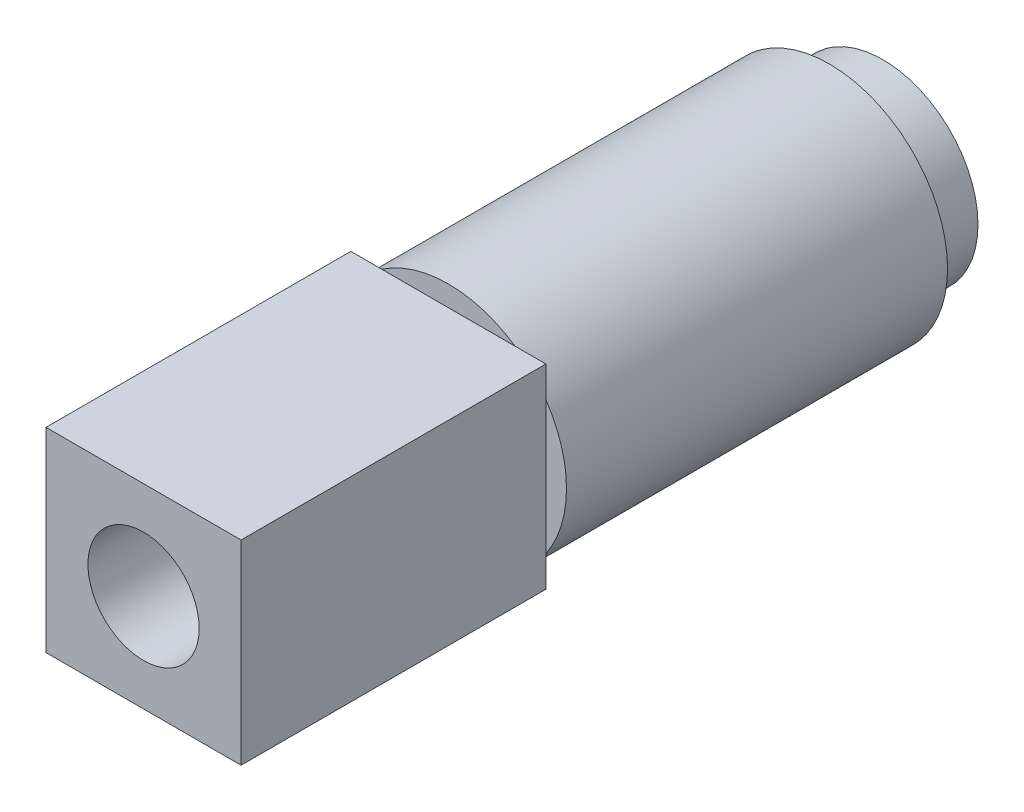
ISO-10303-21;
HEADER;
FILE_DESCRIPTION(('STEP AP214'),'2;1');
FILE_NAME('part.step','',(''),(''),'','','');
FILE_SCHEMA(('AUTOMOTIVE_DESIGN { 1 0 10303 214 1 1 1 1 }'));
ENDSEC;
DATA;
#1=APPLICATION_CONTEXT('core data for automotive mechanical design processes');
#2=APPLICATION_PROTOCOL_DEFINITION('international standard','automotive_design',2000,#1);
#3=PRODUCT_CONTEXT('',#1,'mechanical');
#4=PRODUCT('Part','Part','',(#3));
#5=PRODUCT_RELATED_PRODUCT_CATEGORY('part','',(#4));
#6=PRODUCT_DEFINITION_FORMATION('','',#4);
#7=PRODUCT_DEFINITION_CONTEXT('part definition',#1,'design');
#8=PRODUCT_DEFINITION('design','',#6,#7);
#9=PRODUCT_DEFINITION_SHAPE('','',#8);
#10=(LENGTH_UNIT() NAMED_UNIT(*) SI_UNIT(.MILLI.,.METRE.));
#11=(NAMED_UNIT(*) PLANE_ANGLE_UNIT() SI_UNIT($,.RADIAN.));
#12=(NAMED_UNIT(*) SI_UNIT($,.STERADIAN.) SOLID_ANGLE_UNIT());
#13=UNCERTAINTY_MEASURE_WITH_UNIT(LENGTH_MEASURE(1.E-05),#10,'distance_accuracy_value','');
#14=(GEOMETRIC_REPRESENTATION_CONTEXT(3) GLOBAL_UNCERTAINTY_ASSIGNED_CONTEXT((#13)) GLOBAL_UNIT_ASSIGNED_CONTEXT((#10,
#11,#12)) REPRESENTATION_CONTEXT('',''));
#15=CARTESIAN_POINT('',(0.,0.,0.));
#16=DIRECTION('',(0.,0.,1.));
#17=DIRECTION('',(1.,0.,0.));
#18=AXIS2_PLACEMENT_3D('',#15,#16,#17);
#19=CARTESIAN_POINT('',(0.,0.,7.239));
#20=DIRECTION('',(0.,0.,1.));
#21=DIRECTION('',(1.,0.,0.));
#22=AXIS2_PLACEMENT_3D('',#19,#20,#21);
#23=PLANE('',#22);
#24=DIRECTION('',(0.,-1.,0.));
#25=VECTOR('',#24,1.);
#26=CARTESIAN_POINT('',(-1.6256,-1.6256,7.239));
#27=LINE('',#26,#25);
#28=CARTESIAN_POINT('',(-1.6256,1.11014273406621,7.239));
#29=VERTEX_POINT('',#28);
#30=CARTESIAN_POINT('',(-1.6256,-1.11014273406621,7.239));
#31=VERTEX_POINT('',#30);
#32=EDGE_CURVE('E11',#29,#31,#27,.T.);
#33=ORIENTED_EDGE('',*,*,#32,.F.);
#34=CARTESIAN_POINT('',(0.,0.,7.239));
#35=DIRECTION('',(0.,0.,1.));
#36=DIRECTION('',(1.,0.,0.));
#37=AXIS2_PLACEMENT_3D('',#34,#35,#36);
#38=CIRCLE('',#37,1.9685);
#39=EDGE_CURVE('E437',#29,#31,#38,.T.);
#40=ORIENTED_EDGE('',*,*,#39,.T.);
#41=EDGE_LOOP('',(#33,#40));
#42=FACE_BOUND('',#41,.T.);
#43=ADVANCED_FACE('F39',(#42),#23,.T.);
#44=DIRECTION('',(-1.,0.,0.));
#45=VECTOR('',#44,1.);
#46=CARTESIAN_POINT('',(1.6256,1.6256,7.239));
#47=LINE('',#46,#45);
#48=CARTESIAN_POINT('',(1.11014273406621,1.6256,7.239));
#49=VERTEX_POINT('',#48);
#50=CARTESIAN_POINT('',(-1.11014273406621,1.6256,7.239));
#51=VERTEX_POINT('',#50);
#52=EDGE_CURVE('E48',#49,#51,#47,.T.);
#53=ORIENTED_EDGE('',*,*,#52,.F.);
#54=EDGE_CURVE('E145',#49,#51,#38,.T.);
#55=ORIENTED_EDGE('',*,*,#54,.T.);
#56=EDGE_LOOP('',(#53,#55));
#57=FACE_BOUND('',#56,.T.);
#58=ADVANCED_FACE('F170',(#57),#23,.T.);
#59=DIRECTION('',(0.,1.,0.));
#60=VECTOR('',#59,1.);
#61=CARTESIAN_POINT('',(1.6256,-1.6256,7.239));
#62=LINE('',#61,#60);
#63=CARTESIAN_POINT('',(1.6256,-1.11014273406621,7.239));
#64=VERTEX_POINT('',#63);
#65=CARTESIAN_POINT('',(1.6256,1.11014273406621,7.239));
#66=VERTEX_POINT('',#65);
#67=EDGE_CURVE('E57',#64,#66,#62,.T.);
#68=ORIENTED_EDGE('',*,*,#67,.F.);
#69=EDGE_CURVE('E137',#64,#66,#38,.T.);
#70=ORIENTED_EDGE('',*,*,#69,.T.);
#71=EDGE_LOOP('',(#68,#70));
#72=FACE_BOUND('',#71,.T.);
#73=ADVANCED_FACE('F167',(#72),#23,.T.);
#74=CARTESIAN_POINT('',(0.,0.,0.889));
#75=DIRECTION('',(0.,0.,-1.));
#76=DIRECTION('',(-1.,0.,0.));
#77=AXIS2_PLACEMENT_3D('',#74,#75,#76);
#78=CYLINDRICAL_SURFACE('',#77,1.5875);
#79=CARTESIAN_POINT('',(0.,0.,0.889));
#80=DIRECTION('',(0.,0.,1.));
#81=DIRECTION('',(1.,0.,0.));
#82=AXIS2_PLACEMENT_3D('',#79,#80,#81);
#83=CIRCLE('',#82,1.5875);
#84=CARTESIAN_POINT('',(1.5875,0.,0.889));
#85=VERTEX_POINT('',#84);
#86=EDGE_CURVE('E146',#85,#85,#83,.T.);
#87=ORIENTED_EDGE('',*,*,#86,.F.);
#88=EDGE_LOOP('',(#87));
#89=FACE_BOUND('',#88,.T.);
#90=CARTESIAN_POINT('',(0.,0.,0.));
#91=DIRECTION('',(0.,0.,1.));
#92=DIRECTION('',(1.,0.,0.));
#93=AXIS2_PLACEMENT_3D('',#90,#91,#92);
#94=CIRCLE('',#93,1.5875);
#95=CARTESIAN_POINT('',(1.5875,0.,0.));
#96=VERTEX_POINT('',#95);
#97=EDGE_CURVE('E43',#96,#96,#94,.T.);
#98=ORIENTED_EDGE('',*,*,#97,.T.);
#99=EDGE_LOOP('',(#98));
#100=FACE_BOUND('',#99,.T.);
#101=ADVANCED_FACE('F41',(#89,#100),#78,.T.);
#102=CARTESIAN_POINT('',(0.,0.,0.));
#103=DIRECTION('',(0.,0.,1.));
#104=DIRECTION('',(1.,0.,0.));
#105=AXIS2_PLACEMENT_3D('',#102,#103,#104);
#106=PLANE('',#105);
#107=ORIENTED_EDGE('',*,*,#97,.F.);
#108=EDGE_LOOP('',(#107));
#109=FACE_BOUND('',#108,.T.);
#110=ADVANCED_FACE('F157',(#109),#106,.F.);
#111=CARTESIAN_POINT('',(0.,0.,7.239));
#112=DIRECTION('',(0.,0.,-1.));
#113=DIRECTION('',(-1.,0.,0.));
#114=AXIS2_PLACEMENT_3D('',#111,#112,#113);
#115=CYLINDRICAL_SURFACE('',#114,1.9685);
#116=EDGE_CURVE('E143',#66,#49,#38,.T.);
#117=ORIENTED_EDGE('',*,*,#116,.F.);
#118=ORIENTED_EDGE('',*,*,#69,.F.);
#119=CARTESIAN_POINT('',(1.11014273406621,-1.6256,7.239));
#120=VERTEX_POINT('',#119);
#121=EDGE_CURVE('E443',#120,#64,#38,.T.);
#122=ORIENTED_EDGE('',*,*,#121,.F.);
#123=CARTESIAN_POINT('',(-1.11014273406621,-1.6256,7.239));
#124=VERTEX_POINT('',#123);
#125=EDGE_CURVE('E442',#124,#120,#38,.T.);
#126=ORIENTED_EDGE('',*,*,#125,.F.);
#127=EDGE_CURVE('E440',#31,#124,#38,.T.);
#128=ORIENTED_EDGE('',*,*,#127,.F.);
#129=ORIENTED_EDGE('',*,*,#39,.F.);
#130=EDGE_CURVE('E435',#51,#29,#38,.T.);
#131=ORIENTED_EDGE('',*,*,#130,.F.);
#132=ORIENTED_EDGE('',*,*,#54,.F.);
#133=EDGE_LOOP('',(#117,#118,#122,#126,#128,#129,#131,#132));
#134=FACE_BOUND('',#133,.T.);
#135=CARTESIAN_POINT('',(0.,0.,0.889));
#136=DIRECTION('',(0.,0.,1.));
#137=DIRECTION('',(1.,0.,0.));
#138=AXIS2_PLACEMENT_3D('',#135,#136,#137);
#139=CIRCLE('',#138,1.9685);
#140=CARTESIAN_POINT('',(1.9685,0.,0.889));
#141=VERTEX_POINT('',#140);
#142=EDGE_CURVE('E134',#141,#141,#139,.T.);
#143=ORIENTED_EDGE('',*,*,#142,.T.);
#144=EDGE_LOOP('',(#143));
#145=FACE_BOUND('',#144,.T.);
#146=ADVANCED_FACE('F159',(#134,#145),#115,.T.);
#147=DIRECTION('',(1.,0.,0.));
#148=VECTOR('',#147,1.);
#149=CARTESIAN_POINT('',(1.6256,-1.6256,7.239));
#150=LINE('',#149,#148);
#151=EDGE_CURVE('E64',#124,#120,#150,.T.);
#152=ORIENTED_EDGE('',*,*,#151,.F.);
#153=ORIENTED_EDGE('',*,*,#125,.T.);
#154=EDGE_LOOP('',(#152,#153));
#155=FACE_BOUND('',#154,.T.);
#156=ADVANCED_FACE('F164',(#155),#23,.T.);
#157=CARTESIAN_POINT('',(0.,0.,0.889));
#158=DIRECTION('',(0.,0.,1.));
#159=DIRECTION('',(1.,0.,0.));
#160=AXIS2_PLACEMENT_3D('',#157,#158,#159);
#161=PLANE('',#160);
#162=ORIENTED_EDGE('',*,*,#86,.T.);
#163=EDGE_LOOP('',(#162));
#164=FACE_BOUND('',#163,.T.);
#165=ORIENTED_EDGE('',*,*,#142,.F.);
#166=EDGE_LOOP('',(#165));
#167=FACE_BOUND('',#166,.T.);
#168=ADVANCED_FACE('F180',(#164,#167),#161,.F.);
#169=CARTESIAN_POINT('',(0.,0.,7.239));
#170=DIRECTION('',(0.,0.,1.));
#171=DIRECTION('',(1.,0.,0.));
#172=AXIS2_PLACEMENT_3D('',#169,#170,#171);
#173=PLANE('',#172);
#174=CARTESIAN_POINT('',(1.6256,1.6256,7.239));
#175=VERTEX_POINT('',#174);
#176=EDGE_CURVE('E415',#66,#175,#62,.T.);
#177=ORIENTED_EDGE('',*,*,#176,.F.);
#178=ORIENTED_EDGE('',*,*,#116,.T.);
#179=EDGE_CURVE('E128',#175,#49,#47,.T.);
#180=ORIENTED_EDGE('',*,*,#179,.F.);
#181=EDGE_LOOP('',(#177,#178,#180));
#182=FACE_BOUND('',#181,.T.);
#183=ADVANCED_FACE('F184',(#182),#173,.F.);
#184=CARTESIAN_POINT('',(-1.6256,1.6256,7.239));
#185=VERTEX_POINT('',#184);
#186=EDGE_CURVE('E419',#51,#185,#47,.T.);
#187=ORIENTED_EDGE('',*,*,#186,.F.);
#188=ORIENTED_EDGE('',*,*,#130,.T.);
#189=EDGE_CURVE('E50',#185,#29,#27,.T.);
#190=ORIENTED_EDGE('',*,*,#189,.F.);
#191=EDGE_LOOP('',(#187,#188,#190));
#192=FACE_BOUND('',#191,.T.);
#193=ADVANCED_FACE('F224',(#192),#173,.F.);
#194=CARTESIAN_POINT('',(-1.6256,-1.6256,7.239));
#195=VERTEX_POINT('',#194);
#196=EDGE_CURVE('E51',#31,#195,#27,.T.);
#197=ORIENTED_EDGE('',*,*,#196,.F.);
#198=ORIENTED_EDGE('',*,*,#127,.T.);
#199=EDGE_CURVE('E151',#195,#124,#150,.T.);
#200=ORIENTED_EDGE('',*,*,#199,.F.);
#201=EDGE_LOOP('',(#197,#198,#200));
#202=FACE_BOUND('',#201,.T.);
#203=ADVANCED_FACE('F235',(#202),#173,.F.);
#204=CARTESIAN_POINT('',(1.6256,-1.6256,7.239));
#205=VERTEX_POINT('',#204);
#206=EDGE_CURVE('E152',#120,#205,#150,.T.);
#207=ORIENTED_EDGE('',*,*,#206,.F.);
#208=ORIENTED_EDGE('',*,*,#121,.T.);
#209=EDGE_CURVE('E416',#205,#64,#62,.T.);
#210=ORIENTED_EDGE('',*,*,#209,.F.);
#211=EDGE_LOOP('',(#207,#208,#210));
#212=FACE_BOUND('',#211,.T.);
#213=ADVANCED_FACE('F227',(#212),#173,.F.);
#214=CARTESIAN_POINT('',(-1.6256,-1.6256,12.319));
#215=DIRECTION('',(1.,0.,0.));
#216=DIRECTION('',(0.,0.,-1.));
#217=AXIS2_PLACEMENT_3D('',#214,#215,#216);
#218=PLANE('',#217);
#219=ORIENTED_EDGE('',*,*,#189,.T.);
#220=ORIENTED_EDGE('',*,*,#32,.T.);
#221=ORIENTED_EDGE('',*,*,#196,.T.);
#222=DIRECTION('',(0.,0.,-1.));
#223=VECTOR('',#222,1.);
#224=CARTESIAN_POINT('',(-1.6256,-1.6256,12.319));
#225=LINE('',#224,#223);
#226=CARTESIAN_POINT('',(-1.6256,-1.6256,12.319));
#227=VERTEX_POINT('',#226);
#228=EDGE_CURVE('E113',#227,#195,#225,.T.);
#229=ORIENTED_EDGE('',*,*,#228,.F.);
#230=DIRECTION('',(0.,-1.,0.));
#231=VECTOR('',#230,1.);
#232=CARTESIAN_POINT('',(-1.6256,-1.6256,12.319));
#233=LINE('',#232,#231);
#234=CARTESIAN_POINT('',(-1.6256,1.6256,12.319));
#235=VERTEX_POINT('',#234);
#236=EDGE_CURVE('E119',#235,#227,#233,.T.);
#237=ORIENTED_EDGE('',*,*,#236,.F.);
#238=DIRECTION('',(0.,0.,-1.));
#239=VECTOR('',#238,1.);
#240=CARTESIAN_POINT('',(-1.6256,1.6256,12.319));
#241=LINE('',#240,#239);
#242=EDGE_CURVE('E413',#235,#185,#241,.T.);
#243=ORIENTED_EDGE('',*,*,#242,.T.);
#244=EDGE_LOOP('',(#219,#220,#221,#229,#237,#243));
#245=FACE_BOUND('',#244,.T.);
#246=ADVANCED_FACE('F131',(#245),#218,.F.);
#247=CARTESIAN_POINT('',(1.6256,-1.6256,12.319));
#248=DIRECTION('',(0.,1.,0.));
#249=DIRECTION('',(-1.,0.,0.));
#250=AXIS2_PLACEMENT_3D('',#247,#248,#249);
#251=PLANE('',#250);
#252=ORIENTED_EDGE('',*,*,#199,.T.);
#253=ORIENTED_EDGE('',*,*,#151,.T.);
#254=ORIENTED_EDGE('',*,*,#206,.T.);
#255=DIRECTION('',(0.,0.,-1.));
#256=VECTOR('',#255,1.);
#257=CARTESIAN_POINT('',(1.6256,-1.6256,12.319));
#258=LINE('',#257,#256);
#259=CARTESIAN_POINT('',(1.6256,-1.6256,12.319));
#260=VERTEX_POINT('',#259);
#261=EDGE_CURVE('E115',#260,#205,#258,.T.);
#262=ORIENTED_EDGE('',*,*,#261,.F.);
#263=DIRECTION('',(1.,0.,0.));
#264=VECTOR('',#263,1.);
#265=CARTESIAN_POINT('',(1.6256,-1.6256,12.319));
#266=LINE('',#265,#264);
#267=EDGE_CURVE('E108',#227,#260,#266,.T.);
#268=ORIENTED_EDGE('',*,*,#267,.F.);
#269=ORIENTED_EDGE('',*,*,#228,.T.);
#270=EDGE_LOOP('',(#252,#253,#254,#262,#268,#269));
#271=FACE_BOUND('',#270,.T.);
#272=ADVANCED_FACE('F111',(#271),#251,.F.);
#273=CARTESIAN_POINT('',(1.6256,-1.6256,12.319));
#274=DIRECTION('',(-1.,0.,0.));
#275=DIRECTION('',(0.,0.,1.));
#276=AXIS2_PLACEMENT_3D('',#273,#274,#275);
#277=PLANE('',#276);
#278=ORIENTED_EDGE('',*,*,#209,.T.);
#279=ORIENTED_EDGE('',*,*,#67,.T.);
#280=ORIENTED_EDGE('',*,*,#176,.T.);
#281=DIRECTION('',(0.,0.,-1.));
#282=VECTOR('',#281,1.);
#283=CARTESIAN_POINT('',(1.6256,1.6256,12.319));
#284=LINE('',#283,#282);
#285=CARTESIAN_POINT('',(1.6256,1.6256,12.319));
#286=VERTEX_POINT('',#285);
#287=EDGE_CURVE('E139',#286,#175,#284,.T.);
#288=ORIENTED_EDGE('',*,*,#287,.F.);
#289=DIRECTION('',(0.,1.,0.));
#290=VECTOR('',#289,1.);
#291=CARTESIAN_POINT('',(1.6256,-1.6256,12.319));
#292=LINE('',#291,#290);
#293=EDGE_CURVE('E118',#260,#286,#292,.T.);
#294=ORIENTED_EDGE('',*,*,#293,.F.);
#295=ORIENTED_EDGE('',*,*,#261,.T.);
#296=EDGE_LOOP('',(#278,#279,#280,#288,#294,#295));
#297=FACE_BOUND('',#296,.T.);
#298=ADVANCED_FACE('F267',(#297),#277,.F.);
#299=CARTESIAN_POINT('',(1.6256,1.6256,12.319));
#300=DIRECTION('',(0.,-1.,0.));
#301=DIRECTION('',(1.,0.,0.));
#302=AXIS2_PLACEMENT_3D('',#299,#300,#301);
#303=PLANE('',#302);
#304=ORIENTED_EDGE('',*,*,#179,.T.);
#305=ORIENTED_EDGE('',*,*,#52,.T.);
#306=ORIENTED_EDGE('',*,*,#186,.T.);
#307=ORIENTED_EDGE('',*,*,#242,.F.);
#308=DIRECTION('',(-1.,0.,0.));
#309=VECTOR('',#308,1.);
#310=CARTESIAN_POINT('',(1.6256,1.6256,12.319));
#311=LINE('',#310,#309);
#312=EDGE_CURVE('E124',#286,#235,#311,.T.);
#313=ORIENTED_EDGE('',*,*,#312,.F.);
#314=ORIENTED_EDGE('',*,*,#287,.T.);
#315=EDGE_LOOP('',(#304,#305,#306,#307,#313,#314));
#316=FACE_BOUND('',#315,.T.);
#317=ADVANCED_FACE('F276',(#316),#303,.F.);
#318=CARTESIAN_POINT('',(0.,0.,12.319));
#319=DIRECTION('',(0.,0.,1.));
#320=DIRECTION('',(1.,0.,0.));
#321=AXIS2_PLACEMENT_3D('',#318,#319,#320);
#322=PLANE('',#321);
#323=CARTESIAN_POINT('',(0.,0.,12.319));
#324=DIRECTION('',(0.,0.,1.));
#325=DIRECTION('',(1.,0.,0.));
#326=AXIS2_PLACEMENT_3D('',#323,#324,#325);
#327=CIRCLE('',#326,0.9271);
#328=CARTESIAN_POINT('',(0.9271,0.,12.319));
#329=VERTEX_POINT('',#328);
#330=EDGE_CURVE('E407',#329,#329,#327,.T.);
#331=ORIENTED_EDGE('',*,*,#330,.F.);
#332=EDGE_LOOP('',(#331));
#333=FACE_BOUND('',#332,.T.);
#334=ORIENTED_EDGE('',*,*,#236,.T.);
#335=ORIENTED_EDGE('',*,*,#267,.T.);
#336=ORIENTED_EDGE('',*,*,#293,.T.);
#337=ORIENTED_EDGE('',*,*,#312,.T.);
#338=EDGE_LOOP('',(#334,#335,#336,#337));
#339=FACE_BOUND('',#338,.T.);
#340=ADVANCED_FACE('F122',(#333,#339),#322,.T.);
#341=CARTESIAN_POINT('',(0.,0.,7.239));
#342=DIRECTION('',(0.,0.,1.));
#343=DIRECTION('',(1.,0.,0.));
#344=AXIS2_PLACEMENT_3D('',#341,#342,#343);
#345=CYLINDRICAL_SURFACE('',#344,0.9271);
#346=CARTESIAN_POINT('',(0.,0.,7.239));
#347=DIRECTION('',(0.,0.,1.));
#348=DIRECTION('',(1.,0.,0.));
#349=AXIS2_PLACEMENT_3D('',#346,#347,#348);
#350=CIRCLE('',#349,0.9271);
#351=CARTESIAN_POINT('',(0.9271,0.,7.239));
#352=VERTEX_POINT('',#351);
#353=EDGE_CURVE('E406',#352,#352,#350,.T.);
#354=ORIENTED_EDGE('',*,*,#353,.F.);
#355=EDGE_LOOP('',(#354));
#356=FACE_BOUND('',#355,.T.);
#357=ORIENTED_EDGE('',*,*,#330,.T.);
#358=EDGE_LOOP('',(#357));
#359=FACE_BOUND('',#358,.T.);
#360=ADVANCED_FACE('F295',(#356,#359),#345,.F.);
#361=CARTESIAN_POINT('',(0.,0.,7.239));
#362=DIRECTION('',(0.,0.,1.));
#363=DIRECTION('',(1.,0.,0.));
#364=AXIS2_PLACEMENT_3D('',#361,#362,#363);
#365=PLANE('',#364);
#366=ORIENTED_EDGE('',*,*,#353,.T.);
#367=EDGE_LOOP('',(#366));
#368=FACE_BOUND('',#367,.T.);
#369=ADVANCED_FACE('F305',(#368),#365,.T.);
#370=CLOSED_SHELL('',(#43,#58,#73,#101,#110,#146,#156,#168,#183,#193,#203,#213,#246,#272,#298,
#317,#340,#360,#369));
#371=MANIFOLD_SOLID_BREP('B2',#370);
#372=ADVANCED_BREP_SHAPE_REPRESENTATION('',(#18,#371),#14);
#373=SHAPE_DEFINITION_REPRESENTATION(#9,#372);
ENDSEC;
END-ISO-10303-21;
